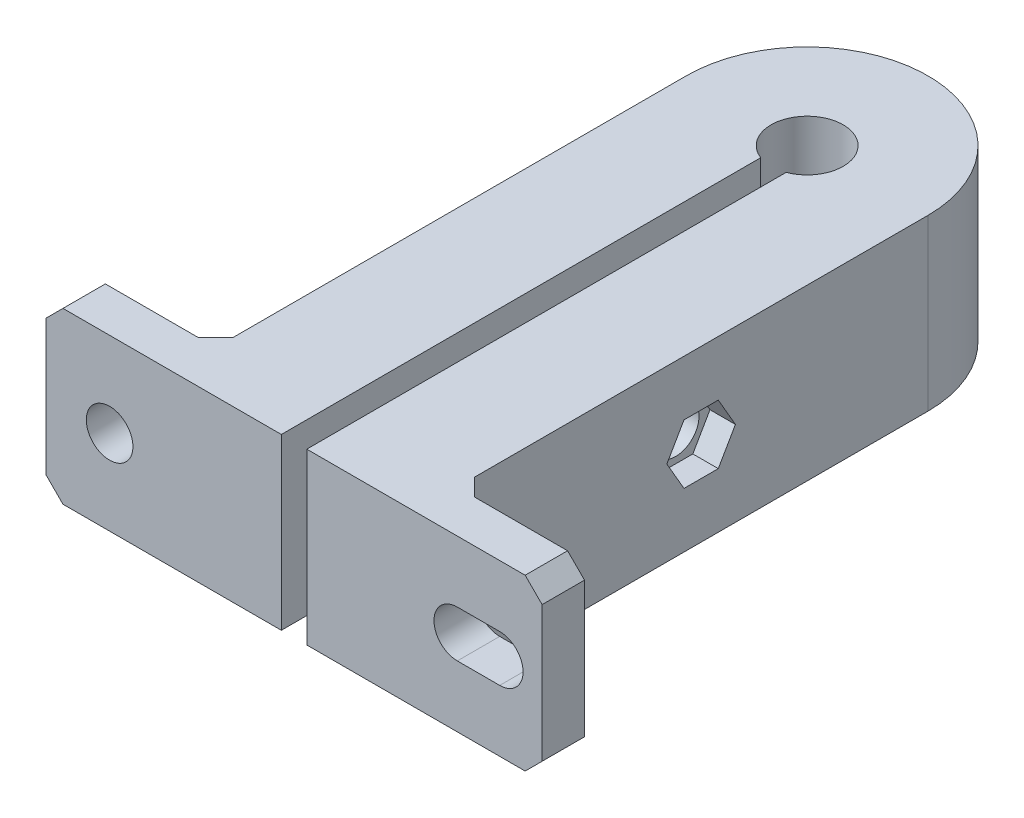
ISO-10303-21;
HEADER;
FILE_DESCRIPTION(('STEP AP214'),'2;1');
FILE_NAME('part.step','',(''),(''),'','','');
FILE_SCHEMA(('AUTOMOTIVE_DESIGN { 1 0 10303 214 1 1 1 1 }'));
ENDSEC;
DATA;
#1=APPLICATION_CONTEXT('core data for automotive mechanical design processes');
#2=APPLICATION_PROTOCOL_DEFINITION('international standard','automotive_design',2000,#1);
#3=PRODUCT_CONTEXT('',#1,'mechanical');
#4=PRODUCT('Part','Part','',(#3));
#5=PRODUCT_RELATED_PRODUCT_CATEGORY('part','',(#4));
#6=PRODUCT_DEFINITION_FORMATION('','',#4);
#7=PRODUCT_DEFINITION_CONTEXT('part definition',#1,'design');
#8=PRODUCT_DEFINITION('design','',#6,#7);
#9=PRODUCT_DEFINITION_SHAPE('','',#8);
#10=(LENGTH_UNIT() NAMED_UNIT(*) SI_UNIT(.MILLI.,.METRE.));
#11=(NAMED_UNIT(*) PLANE_ANGLE_UNIT() SI_UNIT($,.RADIAN.));
#12=(NAMED_UNIT(*) SI_UNIT($,.STERADIAN.) SOLID_ANGLE_UNIT());
#13=UNCERTAINTY_MEASURE_WITH_UNIT(LENGTH_MEASURE(1.E-05),#10,'distance_accuracy_value','');
#14=(GEOMETRIC_REPRESENTATION_CONTEXT(3) GLOBAL_UNCERTAINTY_ASSIGNED_CONTEXT((#13)) GLOBAL_UNIT_ASSIGNED_CONTEXT((#10,
#11,#12)) REPRESENTATION_CONTEXT('',''));
#15=CARTESIAN_POINT('',(0.,0.,0.));
#16=DIRECTION('',(0.,0.,1.));
#17=DIRECTION('',(1.,0.,0.));
#18=AXIS2_PLACEMENT_3D('',#15,#16,#17);
#19=CARTESIAN_POINT('',(-20.75,10.,26.75));
#20=DIRECTION('',(1.,0.,0.));
#21=DIRECTION('',(0.,0.,-1.));
#22=AXIS2_PLACEMENT_3D('',#19,#20,#21);
#23=CYLINDRICAL_SURFACE('',#22,2.75);
#24=CARTESIAN_POINT('',(-1.5,10.,26.75));
#25=DIRECTION('',(-1.,0.,0.));
#26=DIRECTION('',(0.,0.,1.));
#27=AXIS2_PLACEMENT_3D('',#24,#25,#26);
#28=CIRCLE('',#27,2.75);
#29=CARTESIAN_POINT('',(-1.5,10.,29.5));
#30=VERTEX_POINT('',#29);
#31=EDGE_CURVE('E279',#30,#30,#28,.T.);
#32=ORIENTED_EDGE('',*,*,#31,.F.);
#33=EDGE_LOOP('',(#32));
#34=FACE_BOUND('',#33,.T.);
#35=CARTESIAN_POINT('',(-10.25,10.,26.75));
#36=DIRECTION('',(-1.,0.,0.));
#37=DIRECTION('',(0.,0.,1.));
#38=AXIS2_PLACEMENT_3D('',#35,#36,#37);
#39=CIRCLE('',#38,2.75);
#40=CARTESIAN_POINT('',(-10.25,10.,29.5));
#41=VERTEX_POINT('',#40);
#42=EDGE_CURVE('E37',#41,#41,#39,.F.);
#43=ORIENTED_EDGE('',*,*,#42,.F.);
#44=EDGE_LOOP('',(#43));
#45=FACE_BOUND('',#44,.T.);
#46=ADVANCED_FACE('F33',(#34,#45),#23,.F.);
#47=CARTESIAN_POINT('',(1.5,10.,26.75));
#48=DIRECTION('',(-1.,0.,0.));
#49=DIRECTION('',(0.,0.,1.));
#50=AXIS2_PLACEMENT_3D('',#47,#48,#49);
#51=CIRCLE('',#50,2.75);
#52=CARTESIAN_POINT('',(1.5,10.,29.5));
#53=VERTEX_POINT('',#52);
#54=EDGE_CURVE('E283',#53,#53,#51,.T.);
#55=ORIENTED_EDGE('',*,*,#54,.T.);
#56=EDGE_LOOP('',(#55));
#57=FACE_BOUND('',#56,.T.);
#58=CARTESIAN_POINT('',(11.25,10.,26.75));
#59=DIRECTION('',(1.,0.,0.));
#60=DIRECTION('',(0.,0.,-1.));
#61=AXIS2_PLACEMENT_3D('',#58,#59,#60);
#62=CIRCLE('',#61,2.75);
#63=CARTESIAN_POINT('',(11.25,10.,24.));
#64=VERTEX_POINT('',#63);
#65=EDGE_CURVE('E271',#64,#64,#62,.F.);
#66=ORIENTED_EDGE('',*,*,#65,.F.);
#67=EDGE_LOOP('',(#66));
#68=FACE_BOUND('',#67,.T.);
#69=ADVANCED_FACE('F452',(#57,#68),#23,.F.);
#70=CARTESIAN_POINT('',(14.25,20.,60.5));
#71=DIRECTION('',(-1.,0.,0.));
#72=DIRECTION('',(0.,0.,1.));
#73=AXIS2_PLACEMENT_3D('',#70,#71,#72);
#74=PLANE('',#73);
#75=DIRECTION('',(0.,0.866025403784438,0.5));
#76=VECTOR('',#75,1.);
#77=CARTESIAN_POINT('',(14.25,10.,22.7085481156726));
#78=LINE('',#77,#76);
#79=CARTESIAN_POINT('',(14.25,10.,22.7085481156726));
#80=VERTEX_POINT('',#79);
#81=CARTESIAN_POINT('',(14.25,13.5,24.7292740578363));
#82=VERTEX_POINT('',#81);
#83=EDGE_CURVE('E259',#80,#82,#78,.T.);
#84=ORIENTED_EDGE('',*,*,#83,.F.);
#85=DIRECTION('',(0.,0.866025403784438,-0.5));
#86=VECTOR('',#85,1.);
#87=CARTESIAN_POINT('',(14.25,6.5,24.7292740578363));
#88=LINE('',#87,#86);
#89=CARTESIAN_POINT('',(14.25,6.5,24.7292740578363));
#90=VERTEX_POINT('',#89);
#91=EDGE_CURVE('E50',#90,#80,#88,.T.);
#92=ORIENTED_EDGE('',*,*,#91,.F.);
#93=DIRECTION('',(0.,0.,-1.));
#94=VECTOR('',#93,1.);
#95=CARTESIAN_POINT('',(14.25,6.5,28.7707259421637));
#96=LINE('',#95,#94);
#97=CARTESIAN_POINT('',(14.25,6.5,28.7707259421637));
#98=VERTEX_POINT('',#97);
#99=EDGE_CURVE('E242',#98,#90,#96,.T.);
#100=ORIENTED_EDGE('',*,*,#99,.F.);
#101=DIRECTION('',(0.,-0.866025403784439,-0.5));
#102=VECTOR('',#101,1.);
#103=CARTESIAN_POINT('',(14.25,10.,30.7914518843274));
#104=LINE('',#103,#102);
#105=CARTESIAN_POINT('',(14.25,10.,30.7914518843274));
#106=VERTEX_POINT('',#105);
#107=EDGE_CURVE('E245',#106,#98,#104,.T.);
#108=ORIENTED_EDGE('',*,*,#107,.F.);
#109=DIRECTION('',(0.,-0.866025403784439,0.5));
#110=VECTOR('',#109,1.);
#111=CARTESIAN_POINT('',(14.25,13.5,28.7707259421637));
#112=LINE('',#111,#110);
#113=CARTESIAN_POINT('',(14.25,13.5,28.7707259421637));
#114=VERTEX_POINT('',#113);
#115=EDGE_CURVE('E264',#114,#106,#112,.T.);
#116=ORIENTED_EDGE('',*,*,#115,.F.);
#117=DIRECTION('',(0.,0.,1.));
#118=VECTOR('',#117,1.);
#119=CARTESIAN_POINT('',(14.25,13.5,24.7292740578363));
#120=LINE('',#119,#118);
#121=EDGE_CURVE('E261',#82,#114,#120,.T.);
#122=ORIENTED_EDGE('',*,*,#121,.F.);
#123=EDGE_LOOP('',(#84,#92,#100,#108,#116,#122));
#124=FACE_BOUND('',#123,.T.);
#125=DIRECTION('',(0.,0.,-1.));
#126=VECTOR('',#125,1.);
#127=CARTESIAN_POINT('',(14.25,20.,60.5));
#128=LINE('',#127,#126);
#129=CARTESIAN_POINT('',(14.25,20.,53.5));
#130=VERTEX_POINT('',#129);
#131=CARTESIAN_POINT('',(14.25,20.,0.));
#132=VERTEX_POINT('',#131);
#133=EDGE_CURVE('E374',#130,#132,#128,.T.);
#134=ORIENTED_EDGE('',*,*,#133,.F.);
#135=DIRECTION('',(0.,-1.,0.));
#136=VECTOR('',#135,1.);
#137=CARTESIAN_POINT('',(14.25,0.,53.5));
#138=LINE('',#137,#136);
#139=CARTESIAN_POINT('',(14.25,0.,53.5));
#140=VERTEX_POINT('',#139);
#141=EDGE_CURVE('E404',#130,#140,#138,.T.);
#142=ORIENTED_EDGE('',*,*,#141,.T.);
#143=DIRECTION('',(0.,0.,-1.));
#144=VECTOR('',#143,1.);
#145=CARTESIAN_POINT('',(14.25,0.,60.5));
#146=LINE('',#145,#144);
#147=CARTESIAN_POINT('',(14.25,0.,0.));
#148=VERTEX_POINT('',#147);
#149=EDGE_CURVE('E368',#140,#148,#146,.T.);
#150=ORIENTED_EDGE('',*,*,#149,.T.);
#151=DIRECTION('',(0.,-1.,0.));
#152=VECTOR('',#151,1.);
#153=CARTESIAN_POINT('',(14.25,20.,0.));
#154=LINE('',#153,#152);
#155=EDGE_CURVE('E376',#132,#148,#154,.T.);
#156=ORIENTED_EDGE('',*,*,#155,.F.);
#157=EDGE_LOOP('',(#134,#142,#150,#156));
#158=FACE_BOUND('',#157,.T.);
#159=ADVANCED_FACE('F454',(#124,#158),#74,.F.);
#160=CARTESIAN_POINT('',(-14.25,20.,0.));
#161=DIRECTION('',(1.,0.,0.));
#162=DIRECTION('',(0.,0.,-1.));
#163=AXIS2_PLACEMENT_3D('',#160,#161,#162);
#164=PLANE('',#163);
#165=CARTESIAN_POINT('',(-14.25,10.,26.75));
#166=DIRECTION('',(-1.,0.,0.));
#167=DIRECTION('',(0.,0.,1.));
#168=AXIS2_PLACEMENT_3D('',#165,#166,#167);
#169=CIRCLE('',#168,4.);
#170=CARTESIAN_POINT('',(-14.25,10.,30.75));
#171=VERTEX_POINT('',#170);
#172=EDGE_CURVE('E248',#171,#171,#169,.T.);
#173=ORIENTED_EDGE('',*,*,#172,.F.);
#174=EDGE_LOOP('',(#173));
#175=FACE_BOUND('',#174,.T.);
#176=DIRECTION('',(0.,0.,1.));
#177=VECTOR('',#176,1.);
#178=CARTESIAN_POINT('',(-14.25,0.,0.));
#179=LINE('',#178,#177);
#180=CARTESIAN_POINT('',(-14.25,0.,0.));
#181=VERTEX_POINT('',#180);
#182=CARTESIAN_POINT('',(-14.25,0.,53.5));
#183=VERTEX_POINT('',#182);
#184=EDGE_CURVE('E379',#181,#183,#179,.T.);
#185=ORIENTED_EDGE('',*,*,#184,.T.);
#186=DIRECTION('',(0.,1.,0.));
#187=VECTOR('',#186,1.);
#188=CARTESIAN_POINT('',(-14.25,20.,53.5));
#189=LINE('',#188,#187);
#190=CARTESIAN_POINT('',(-14.25,20.,53.5));
#191=VERTEX_POINT('',#190);
#192=EDGE_CURVE('E399',#183,#191,#189,.T.);
#193=ORIENTED_EDGE('',*,*,#192,.T.);
#194=DIRECTION('',(0.,0.,1.));
#195=VECTOR('',#194,1.);
#196=CARTESIAN_POINT('',(-14.25,20.,0.));
#197=LINE('',#196,#195);
#198=CARTESIAN_POINT('',(-14.25,20.,0.));
#199=VERTEX_POINT('',#198);
#200=EDGE_CURVE('E367',#199,#191,#197,.T.);
#201=ORIENTED_EDGE('',*,*,#200,.F.);
#202=DIRECTION('',(0.,-1.,0.));
#203=VECTOR('',#202,1.);
#204=CARTESIAN_POINT('',(-14.25,20.,0.));
#205=LINE('',#204,#203);
#206=EDGE_CURVE('E388',#199,#181,#205,.T.);
#207=ORIENTED_EDGE('',*,*,#206,.T.);
#208=EDGE_LOOP('',(#185,#193,#201,#207));
#209=FACE_BOUND('',#208,.T.);
#210=ADVANCED_FACE('F461',(#175,#209),#164,.F.);
#211=CARTESIAN_POINT('',(0.,20.,0.));
#212=DIRECTION('',(0.,1.,0.));
#213=DIRECTION('',(0.,0.,1.));
#214=AXIS2_PLACEMENT_3D('',#211,#212,#213);
#215=PLANE('',#214);
#216=DIRECTION('',(1.,0.,0.));
#217=VECTOR('',#216,1.);
#218=CARTESIAN_POINT('',(-14.25,20.,60.5));
#219=LINE('',#218,#217);
#220=CARTESIAN_POINT('',(1.5,20.,60.5));
#221=VERTEX_POINT('',#220);
#222=CARTESIAN_POINT('',(27.25,20.,60.5));
#223=VERTEX_POINT('',#222);
#224=EDGE_CURVE('E371',#221,#223,#219,.T.);
#225=ORIENTED_EDGE('',*,*,#224,.T.);
#226=DIRECTION('',(0.,0.,-1.));
#227=VECTOR('',#226,1.);
#228=CARTESIAN_POINT('',(27.25,20.,55.5));
#229=LINE('',#228,#227);
#230=CARTESIAN_POINT('',(27.25,20.,55.5));
#231=VERTEX_POINT('',#230);
#232=EDGE_CURVE('E436',#223,#231,#229,.T.);
#233=ORIENTED_EDGE('',*,*,#232,.T.);
#234=DIRECTION('',(1.,0.,0.));
#235=VECTOR('',#234,1.);
#236=CARTESIAN_POINT('',(1.5,20.,55.5));
#237=LINE('',#236,#235);
#238=CARTESIAN_POINT('',(16.25,20.,55.5));
#239=VERTEX_POINT('',#238);
#240=EDGE_CURVE('E327',#239,#231,#237,.T.);
#241=ORIENTED_EDGE('',*,*,#240,.F.);
#242=DIRECTION('',(0.70710678118655,0.,0.707106781186545));
#243=VECTOR('',#242,1.);
#244=CARTESIAN_POINT('',(16.25,20.,55.5));
#245=LINE('',#244,#243);
#246=EDGE_CURVE('E410',#239,#130,#245,.F.);
#247=ORIENTED_EDGE('',*,*,#246,.T.);
#248=ORIENTED_EDGE('',*,*,#133,.T.);
#249=CARTESIAN_POINT('',(0.,20.,0.));
#250=DIRECTION('',(0.,1.,0.));
#251=DIRECTION('',(0.,0.,1.));
#252=AXIS2_PLACEMENT_3D('',#249,#250,#251);
#253=CIRCLE('',#252,14.25);
#254=EDGE_CURVE('E364',#132,#199,#253,.T.);
#255=ORIENTED_EDGE('',*,*,#254,.T.);
#256=ORIENTED_EDGE('',*,*,#200,.T.);
#257=DIRECTION('',(0.707106781186549,0.,-0.707106781186546));
#258=VECTOR('',#257,1.);
#259=CARTESIAN_POINT('',(-16.25,20.,55.5));
#260=LINE('',#259,#258);
#261=CARTESIAN_POINT('',(-16.25,20.,55.5));
#262=VERTEX_POINT('',#261);
#263=EDGE_CURVE('E408',#191,#262,#260,.F.);
#264=ORIENTED_EDGE('',*,*,#263,.T.);
#265=DIRECTION('',(-1.,0.,0.));
#266=VECTOR('',#265,1.);
#267=CARTESIAN_POINT('',(-1.5,20.,55.5));
#268=LINE('',#267,#266);
#269=CARTESIAN_POINT('',(-27.25,20.,55.5));
#270=VERTEX_POINT('',#269);
#271=EDGE_CURVE('E333',#262,#270,#268,.T.);
#272=ORIENTED_EDGE('',*,*,#271,.T.);
#273=DIRECTION('',(0.,0.,1.));
#274=VECTOR('',#273,1.);
#275=CARTESIAN_POINT('',(-27.25,20.,0.));
#276=LINE('',#275,#274);
#277=CARTESIAN_POINT('',(-27.25,20.,60.5));
#278=VERTEX_POINT('',#277);
#279=EDGE_CURVE('E433',#270,#278,#276,.T.);
#280=ORIENTED_EDGE('',*,*,#279,.T.);
#281=CARTESIAN_POINT('',(-1.5,20.,60.5));
#282=VERTEX_POINT('',#281);
#283=EDGE_CURVE('E372',#278,#282,#219,.T.);
#284=ORIENTED_EDGE('',*,*,#283,.T.);
#285=DIRECTION('',(0.,0.,1.));
#286=VECTOR('',#285,1.);
#287=CARTESIAN_POINT('',(-1.5,20.,0.));
#288=LINE('',#287,#286);
#289=CARTESIAN_POINT('',(-1.5,20.,3.97649343014672));
#290=VERTEX_POINT('',#289);
#291=EDGE_CURVE('E352',#290,#282,#288,.T.);
#292=ORIENTED_EDGE('',*,*,#291,.F.);
#293=CARTESIAN_POINT('',(0.,20.,0.));
#294=DIRECTION('',(0.,1.,0.));
#295=DIRECTION('',(0.,0.,1.));
#296=AXIS2_PLACEMENT_3D('',#293,#294,#295);
#297=CIRCLE('',#296,4.25);
#298=CARTESIAN_POINT('',(1.5,20.,3.97649343014672));
#299=VERTEX_POINT('',#298);
#300=EDGE_CURVE('E358',#299,#290,#297,.T.);
#301=ORIENTED_EDGE('',*,*,#300,.F.);
#302=DIRECTION('',(0.,0.,1.));
#303=VECTOR('',#302,1.);
#304=CARTESIAN_POINT('',(1.5,20.,0.));
#305=LINE('',#304,#303);
#306=EDGE_CURVE('E355',#299,#221,#305,.T.);
#307=ORIENTED_EDGE('',*,*,#306,.T.);
#308=EDGE_LOOP('',(#225,#233,#241,#247,#248,#255,#256,#264,#272,#280,#284,#292,#301,#307));
#309=FACE_BOUND('',#308,.T.);
#310=ADVANCED_FACE('F520',(#309),#215,.T.);
#311=CARTESIAN_POINT('',(0.,0.,0.));
#312=DIRECTION('',(0.,1.,0.));
#313=DIRECTION('',(0.,0.,1.));
#314=AXIS2_PLACEMENT_3D('',#311,#312,#313);
#315=PLANE('',#314);
#316=DIRECTION('',(-1.,0.,0.));
#317=VECTOR('',#316,1.);
#318=CARTESIAN_POINT('',(1.5,0.,55.5));
#319=LINE('',#318,#317);
#320=CARTESIAN_POINT('',(27.25,0.,55.5));
#321=VERTEX_POINT('',#320);
#322=CARTESIAN_POINT('',(16.25,0.,55.5));
#323=VERTEX_POINT('',#322);
#324=EDGE_CURVE('E322',#321,#323,#319,.T.);
#325=ORIENTED_EDGE('',*,*,#324,.F.);
#326=DIRECTION('',(0.,0.,1.));
#327=VECTOR('',#326,1.);
#328=CARTESIAN_POINT('',(27.25,0.,0.));
#329=LINE('',#328,#327);
#330=CARTESIAN_POINT('',(27.25,0.,60.5));
#331=VERTEX_POINT('',#330);
#332=EDGE_CURVE('E417',#321,#331,#329,.T.);
#333=ORIENTED_EDGE('',*,*,#332,.T.);
#334=DIRECTION('',(1.,0.,0.));
#335=VECTOR('',#334,1.);
#336=CARTESIAN_POINT('',(-14.25,0.,60.5));
#337=LINE('',#336,#335);
#338=CARTESIAN_POINT('',(1.5,0.,60.5));
#339=VERTEX_POINT('',#338);
#340=EDGE_CURVE('E382',#339,#331,#337,.T.);
#341=ORIENTED_EDGE('',*,*,#340,.F.);
#342=DIRECTION('',(0.,0.,-1.));
#343=VECTOR('',#342,1.);
#344=CARTESIAN_POINT('',(1.5,0.,60.5));
#345=LINE('',#344,#343);
#346=CARTESIAN_POINT('',(1.5,0.,3.97649343014672));
#347=VERTEX_POINT('',#346);
#348=EDGE_CURVE('E340',#339,#347,#345,.T.);
#349=ORIENTED_EDGE('',*,*,#348,.T.);
#350=CARTESIAN_POINT('',(0.,0.,0.));
#351=DIRECTION('',(0.,1.,0.));
#352=DIRECTION('',(0.,0.,1.));
#353=AXIS2_PLACEMENT_3D('',#350,#351,#352);
#354=CIRCLE('',#353,4.25);
#355=CARTESIAN_POINT('',(-1.5,0.,3.97649343014672));
#356=VERTEX_POINT('',#355);
#357=EDGE_CURVE('E357',#347,#356,#354,.T.);
#358=ORIENTED_EDGE('',*,*,#357,.T.);
#359=DIRECTION('',(0.,0.,-1.));
#360=VECTOR('',#359,1.);
#361=CARTESIAN_POINT('',(-1.5,0.,60.5));
#362=LINE('',#361,#360);
#363=CARTESIAN_POINT('',(-1.5,0.,60.5));
#364=VERTEX_POINT('',#363);
#365=EDGE_CURVE('E344',#364,#356,#362,.T.);
#366=ORIENTED_EDGE('',*,*,#365,.F.);
#367=CARTESIAN_POINT('',(-27.25,0.,60.5));
#368=VERTEX_POINT('',#367);
#369=EDGE_CURVE('E383',#368,#364,#337,.T.);
#370=ORIENTED_EDGE('',*,*,#369,.F.);
#371=DIRECTION('',(0.,0.,-1.));
#372=VECTOR('',#371,1.);
#373=CARTESIAN_POINT('',(-27.25,0.,55.5));
#374=LINE('',#373,#372);
#375=CARTESIAN_POINT('',(-27.25,0.,55.5));
#376=VERTEX_POINT('',#375);
#377=EDGE_CURVE('E415',#368,#376,#374,.T.);
#378=ORIENTED_EDGE('',*,*,#377,.T.);
#379=DIRECTION('',(1.,0.,0.));
#380=VECTOR('',#379,1.);
#381=CARTESIAN_POINT('',(-1.5,0.,55.5));
#382=LINE('',#381,#380);
#383=CARTESIAN_POINT('',(-16.25,0.,55.5));
#384=VERTEX_POINT('',#383);
#385=EDGE_CURVE('E338',#376,#384,#382,.T.);
#386=ORIENTED_EDGE('',*,*,#385,.T.);
#387=DIRECTION('',(-0.707106781186549,0.,0.707106781186546));
#388=VECTOR('',#387,1.);
#389=CARTESIAN_POINT('',(19.625,0.,19.6250000000001));
#390=LINE('',#389,#388);
#391=EDGE_CURVE('E406',#384,#183,#390,.F.);
#392=ORIENTED_EDGE('',*,*,#391,.T.);
#393=ORIENTED_EDGE('',*,*,#184,.F.);
#394=CARTESIAN_POINT('',(0.,0.,0.));
#395=DIRECTION('',(0.,1.,0.));
#396=DIRECTION('',(0.,0.,1.));
#397=AXIS2_PLACEMENT_3D('',#394,#395,#396);
#398=CIRCLE('',#397,14.25);
#399=EDGE_CURVE('E361',#148,#181,#398,.T.);
#400=ORIENTED_EDGE('',*,*,#399,.F.);
#401=ORIENTED_EDGE('',*,*,#149,.F.);
#402=DIRECTION('',(-0.70710678118655,0.,-0.707106781186545));
#403=VECTOR('',#402,1.);
#404=CARTESIAN_POINT('',(-19.625,0.,19.6250000000002));
#405=LINE('',#404,#403);
#406=EDGE_CURVE('E412',#140,#323,#405,.F.);
#407=ORIENTED_EDGE('',*,*,#406,.T.);
#408=EDGE_LOOP('',(#325,#333,#341,#349,#358,#366,#370,#378,#386,#392,#393,#400,#401,#407));
#409=FACE_BOUND('',#408,.T.);
#410=ADVANCED_FACE('F523',(#409),#315,.F.);
#411=CARTESIAN_POINT('',(-14.25,20.,60.5));
#412=DIRECTION('',(0.,0.,-1.));
#413=DIRECTION('',(-1.,0.,0.));
#414=AXIS2_PLACEMENT_3D('',#411,#412,#413);
#415=PLANE('',#414);
#416=DIRECTION('',(1.,0.,0.));
#417=VECTOR('',#416,1.);
#418=CARTESIAN_POINT('',(24.25,12.75,60.5));
#419=LINE('',#418,#417);
#420=CARTESIAN_POINT('',(19.25,12.75,60.5));
#421=VERTEX_POINT('',#420);
#422=CARTESIAN_POINT('',(24.25,12.75,60.5));
#423=VERTEX_POINT('',#422);
#424=EDGE_CURVE('E294',#421,#423,#419,.T.);
#425=ORIENTED_EDGE('',*,*,#424,.T.);
#426=CARTESIAN_POINT('',(24.25,10.,60.5));
#427=DIRECTION('',(0.,0.,-1.));
#428=DIRECTION('',(-1.,0.,0.));
#429=AXIS2_PLACEMENT_3D('',#426,#427,#428);
#430=CIRCLE('',#429,2.75);
#431=CARTESIAN_POINT('',(24.25,7.25,60.5));
#432=VERTEX_POINT('',#431);
#433=EDGE_CURVE('E284',#423,#432,#430,.T.);
#434=ORIENTED_EDGE('',*,*,#433,.T.);
#435=DIRECTION('',(-1.,0.,0.));
#436=VECTOR('',#435,1.);
#437=CARTESIAN_POINT('',(24.25,7.25,60.5));
#438=LINE('',#437,#436);
#439=CARTESIAN_POINT('',(19.25,7.25,60.5));
#440=VERTEX_POINT('',#439);
#441=EDGE_CURVE('E287',#432,#440,#438,.T.);
#442=ORIENTED_EDGE('',*,*,#441,.T.);
#443=CARTESIAN_POINT('',(19.25,10.,60.5));
#444=DIRECTION('',(0.,0.,-1.));
#445=DIRECTION('',(-1.,0.,0.));
#446=AXIS2_PLACEMENT_3D('',#443,#444,#445);
#447=CIRCLE('',#446,2.75);
#448=EDGE_CURVE('E291',#440,#421,#447,.T.);
#449=ORIENTED_EDGE('',*,*,#448,.T.);
#450=EDGE_LOOP('',(#425,#434,#442,#449));
#451=FACE_BOUND('',#450,.T.);
#452=ORIENTED_EDGE('',*,*,#340,.T.);
#453=DIRECTION('',(-0.707106781186545,-0.70710678118655,0.));
#454=VECTOR('',#453,1.);
#455=CARTESIAN_POINT('',(27.25,0.,60.5));
#456=LINE('',#455,#454);
#457=CARTESIAN_POINT('',(29.25,2.,60.5));
#458=VERTEX_POINT('',#457);
#459=EDGE_CURVE('E422',#331,#458,#456,.F.);
#460=ORIENTED_EDGE('',*,*,#459,.T.);
#461=DIRECTION('',(0.,-1.,0.));
#462=VECTOR('',#461,1.);
#463=CARTESIAN_POINT('',(29.25,0.,60.5));
#464=LINE('',#463,#462);
#465=CARTESIAN_POINT('',(29.25,18.,60.5));
#466=VERTEX_POINT('',#465);
#467=EDGE_CURVE('E319',#466,#458,#464,.T.);
#468=ORIENTED_EDGE('',*,*,#467,.F.);
#469=DIRECTION('',(-0.70710678118655,0.707106781186545,0.));
#470=VECTOR('',#469,1.);
#471=CARTESIAN_POINT('',(29.25,18.,60.5));
#472=LINE('',#471,#470);
#473=EDGE_CURVE('E420',#466,#223,#472,.T.);
#474=ORIENTED_EDGE('',*,*,#473,.T.);
#475=ORIENTED_EDGE('',*,*,#224,.F.);
#476=DIRECTION('',(0.,-1.,0.));
#477=VECTOR('',#476,1.);
#478=CARTESIAN_POINT('',(1.5,20.000012,60.5));
#479=LINE('',#478,#477);
#480=EDGE_CURVE('E346',#221,#339,#479,.T.);
#481=ORIENTED_EDGE('',*,*,#480,.T.);
#482=EDGE_LOOP('',(#452,#460,#468,#474,#475,#481));
#483=FACE_BOUND('',#482,.T.);
#484=ADVANCED_FACE('F518',(#451,#483),#415,.F.);
#485=CARTESIAN_POINT('',(0.,20.,0.));
#486=DIRECTION('',(0.,-1.,0.));
#487=DIRECTION('',(0.,0.,-1.));
#488=AXIS2_PLACEMENT_3D('',#485,#486,#487);
#489=CYLINDRICAL_SURFACE('',#488,4.25);
#490=ORIENTED_EDGE('',*,*,#357,.F.);
#491=DIRECTION('',(0.,-1.,0.));
#492=VECTOR('',#491,1.);
#493=CARTESIAN_POINT('',(1.5,20.,3.97649343014672));
#494=LINE('',#493,#492);
#495=EDGE_CURVE('E393',#347,#299,#494,.F.);
#496=ORIENTED_EDGE('',*,*,#495,.T.);
#497=ORIENTED_EDGE('',*,*,#300,.T.);
#498=DIRECTION('',(0.,-1.,0.));
#499=VECTOR('',#498,1.);
#500=CARTESIAN_POINT('',(-1.5,20.,3.97649343014672));
#501=LINE('',#500,#499);
#502=EDGE_CURVE('E391',#356,#290,#501,.F.);
#503=ORIENTED_EDGE('',*,*,#502,.F.);
#504=EDGE_LOOP('',(#490,#496,#497,#503));
#505=FACE_BOUND('',#504,.T.);
#506=ADVANCED_FACE('F514',(#505),#489,.F.);
#507=CARTESIAN_POINT('',(0.,20.,0.));
#508=DIRECTION('',(0.,-1.,0.));
#509=DIRECTION('',(0.,0.,-1.));
#510=AXIS2_PLACEMENT_3D('',#507,#508,#509);
#511=CYLINDRICAL_SURFACE('',#510,14.25);
#512=ORIENTED_EDGE('',*,*,#399,.T.);
#513=ORIENTED_EDGE('',*,*,#206,.F.);
#514=ORIENTED_EDGE('',*,*,#254,.F.);
#515=ORIENTED_EDGE('',*,*,#155,.T.);
#516=EDGE_LOOP('',(#512,#513,#514,#515));
#517=FACE_BOUND('',#516,.T.);
#518=ADVANCED_FACE('F517',(#517),#511,.T.);
#519=CARTESIAN_POINT('',(-21.75,9.99999999999999,60.5));
#520=DIRECTION('',(0.,0.,-1.));
#521=DIRECTION('',(-1.,0.,0.));
#522=AXIS2_PLACEMENT_3D('',#519,#520,#521);
#523=CIRCLE('',#522,2.75);
#524=CARTESIAN_POINT('',(-24.5,9.99999999999999,60.5));
#525=VERTEX_POINT('',#524);
#526=EDGE_CURVE('E316',#525,#525,#523,.T.);
#527=ORIENTED_EDGE('',*,*,#526,.T.);
#528=EDGE_LOOP('',(#527));
#529=FACE_BOUND('',#528,.T.);
#530=DIRECTION('',(0.,-1.,0.));
#531=VECTOR('',#530,1.);
#532=CARTESIAN_POINT('',(-29.25,0.,60.5));
#533=LINE('',#532,#531);
#534=CARTESIAN_POINT('',(-29.25,18.,60.5));
#535=VERTEX_POINT('',#534);
#536=CARTESIAN_POINT('',(-29.25,1.99999999999999,60.5));
#537=VERTEX_POINT('',#536);
#538=EDGE_CURVE('E330',#535,#537,#533,.T.);
#539=ORIENTED_EDGE('',*,*,#538,.T.);
#540=DIRECTION('',(0.70710678118655,-0.707106781186545,0.));
#541=VECTOR('',#540,1.);
#542=CARTESIAN_POINT('',(-29.25,1.99999999999999,60.5));
#543=LINE('',#542,#541);
#544=EDGE_CURVE('E445',#537,#368,#543,.T.);
#545=ORIENTED_EDGE('',*,*,#544,.T.);
#546=ORIENTED_EDGE('',*,*,#369,.T.);
#547=DIRECTION('',(0.,-1.,0.));
#548=VECTOR('',#547,1.);
#549=CARTESIAN_POINT('',(-1.5,20.000012,60.5));
#550=LINE('',#549,#548);
#551=EDGE_CURVE('E349',#282,#364,#550,.T.);
#552=ORIENTED_EDGE('',*,*,#551,.F.);
#553=ORIENTED_EDGE('',*,*,#283,.F.);
#554=DIRECTION('',(0.707106781186545,0.70710678118655,0.));
#555=VECTOR('',#554,1.);
#556=CARTESIAN_POINT('',(-27.25,20.,60.5));
#557=LINE('',#556,#555);
#558=EDGE_CURVE('E443',#278,#535,#557,.F.);
#559=ORIENTED_EDGE('',*,*,#558,.T.);
#560=EDGE_LOOP('',(#539,#545,#546,#552,#553,#559));
#561=FACE_BOUND('',#560,.T.);
#562=ADVANCED_FACE('F509',(#529,#561),#415,.F.);
#563=CARTESIAN_POINT('',(-1.5,20.000012,60.5));
#564=DIRECTION('',(-1.,0.,0.));
#565=DIRECTION('',(0.,0.,1.));
#566=AXIS2_PLACEMENT_3D('',#563,#564,#565);
#567=PLANE('',#566);
#568=ORIENTED_EDGE('',*,*,#31,.T.);
#569=EDGE_LOOP('',(#568));
#570=FACE_BOUND('',#569,.T.);
#571=ORIENTED_EDGE('',*,*,#365,.T.);
#572=ORIENTED_EDGE('',*,*,#502,.T.);
#573=ORIENTED_EDGE('',*,*,#291,.T.);
#574=ORIENTED_EDGE('',*,*,#551,.T.);
#575=EDGE_LOOP('',(#571,#572,#573,#574));
#576=FACE_BOUND('',#575,.T.);
#577=ADVANCED_FACE('F506',(#570,#576),#567,.F.);
#578=CARTESIAN_POINT('',(1.5,20.000012,60.5));
#579=DIRECTION('',(-1.,0.,0.));
#580=DIRECTION('',(0.,0.,1.));
#581=AXIS2_PLACEMENT_3D('',#578,#579,#580);
#582=PLANE('',#581);
#583=ORIENTED_EDGE('',*,*,#54,.F.);
#584=EDGE_LOOP('',(#583));
#585=FACE_BOUND('',#584,.T.);
#586=ORIENTED_EDGE('',*,*,#480,.F.);
#587=ORIENTED_EDGE('',*,*,#306,.F.);
#588=ORIENTED_EDGE('',*,*,#495,.F.);
#589=ORIENTED_EDGE('',*,*,#348,.F.);
#590=EDGE_LOOP('',(#586,#587,#588,#589));
#591=FACE_BOUND('',#590,.T.);
#592=ADVANCED_FACE('F501',(#585,#591),#582,.T.);
#593=CARTESIAN_POINT('',(0.,0.,55.5));
#594=DIRECTION('',(0.,0.,1.));
#595=DIRECTION('',(1.,0.,0.));
#596=AXIS2_PLACEMENT_3D('',#593,#594,#595);
#597=PLANE('',#596);
#598=CARTESIAN_POINT('',(-21.75,9.99999999999999,55.5));
#599=DIRECTION('',(0.,0.,-1.));
#600=DIRECTION('',(-1.,0.,0.));
#601=AXIS2_PLACEMENT_3D('',#598,#599,#600);
#602=CIRCLE('',#601,2.75);
#603=CARTESIAN_POINT('',(-24.5,9.99999999999999,55.5));
#604=VERTEX_POINT('',#603);
#605=EDGE_CURVE('E309',#604,#604,#602,.T.);
#606=ORIENTED_EDGE('',*,*,#605,.F.);
#607=EDGE_LOOP('',(#606));
#608=FACE_BOUND('',#607,.T.);
#609=ORIENTED_EDGE('',*,*,#385,.F.);
#610=DIRECTION('',(-0.70710678118655,0.707106781186545,0.));
#611=VECTOR('',#610,1.);
#612=CARTESIAN_POINT('',(-29.25,1.99999999999999,55.5));
#613=LINE('',#612,#611);
#614=CARTESIAN_POINT('',(-29.25,1.99999999999999,55.5));
#615=VERTEX_POINT('',#614);
#616=EDGE_CURVE('E11',#376,#615,#613,.T.);
#617=ORIENTED_EDGE('',*,*,#616,.T.);
#618=DIRECTION('',(0.,-1.,0.));
#619=VECTOR('',#618,1.);
#620=CARTESIAN_POINT('',(-29.25,0.,55.5));
#621=LINE('',#620,#619);
#622=CARTESIAN_POINT('',(-29.25,18.,55.5));
#623=VERTEX_POINT('',#622);
#624=EDGE_CURVE('E336',#623,#615,#621,.T.);
#625=ORIENTED_EDGE('',*,*,#624,.F.);
#626=DIRECTION('',(-0.707106781186545,-0.70710678118655,0.));
#627=VECTOR('',#626,1.);
#628=CARTESIAN_POINT('',(-27.25,20.,55.5));
#629=LINE('',#628,#627);
#630=EDGE_CURVE('E42',#623,#270,#629,.F.);
#631=ORIENTED_EDGE('',*,*,#630,.T.);
#632=ORIENTED_EDGE('',*,*,#271,.F.);
#633=DIRECTION('',(0.,-1.,0.));
#634=VECTOR('',#633,1.);
#635=CARTESIAN_POINT('',(-16.25,0.,55.5));
#636=LINE('',#635,#634);
#637=EDGE_CURVE('E396',#262,#384,#636,.T.);
#638=ORIENTED_EDGE('',*,*,#637,.T.);
#639=EDGE_LOOP('',(#609,#617,#625,#631,#632,#638));
#640=FACE_BOUND('',#639,.T.);
#641=ADVANCED_FACE('F498',(#608,#640),#597,.F.);
#642=CARTESIAN_POINT('',(-29.25,0.,55.5));
#643=DIRECTION('',(-1.,0.,0.));
#644=DIRECTION('',(0.,0.,1.));
#645=AXIS2_PLACEMENT_3D('',#642,#643,#644);
#646=PLANE('',#645);
#647=ORIENTED_EDGE('',*,*,#624,.T.);
#648=DIRECTION('',(0.,0.,1.));
#649=VECTOR('',#648,1.);
#650=CARTESIAN_POINT('',(-29.25,1.99999999999999,60.5));
#651=LINE('',#650,#649);
#652=EDGE_CURVE('E440',#615,#537,#651,.T.);
#653=ORIENTED_EDGE('',*,*,#652,.T.);
#654=ORIENTED_EDGE('',*,*,#538,.F.);
#655=DIRECTION('',(0.,0.,-1.));
#656=VECTOR('',#655,1.);
#657=CARTESIAN_POINT('',(-29.25,18.,55.5));
#658=LINE('',#657,#656);
#659=EDGE_CURVE('E438',#535,#623,#658,.T.);
#660=ORIENTED_EDGE('',*,*,#659,.T.);
#661=EDGE_LOOP('',(#647,#653,#654,#660));
#662=FACE_BOUND('',#661,.T.);
#663=ADVANCED_FACE('F493',(#662),#646,.T.);
#664=CARTESIAN_POINT('',(0.,0.,55.5));
#665=DIRECTION('',(0.,0.,1.));
#666=DIRECTION('',(-1.,0.,0.));
#667=AXIS2_PLACEMENT_3D('',#664,#665,#666);
#668=PLANE('',#667);
#669=DIRECTION('',(-1.,0.,0.));
#670=VECTOR('',#669,1.);
#671=CARTESIAN_POINT('',(24.25,7.25,55.5));
#672=LINE('',#671,#670);
#673=CARTESIAN_POINT('',(24.25,7.25,55.5));
#674=VERTEX_POINT('',#673);
#675=CARTESIAN_POINT('',(19.25,7.25,55.5));
#676=VERTEX_POINT('',#675);
#677=EDGE_CURVE('E299',#674,#676,#672,.T.);
#678=ORIENTED_EDGE('',*,*,#677,.F.);
#679=CARTESIAN_POINT('',(24.25,10.,55.5));
#680=DIRECTION('',(0.,0.,-1.));
#681=DIRECTION('',(-1.,0.,0.));
#682=AXIS2_PLACEMENT_3D('',#679,#680,#681);
#683=CIRCLE('',#682,2.75);
#684=CARTESIAN_POINT('',(24.25,12.75,55.5));
#685=VERTEX_POINT('',#684);
#686=EDGE_CURVE('E282',#685,#674,#683,.T.);
#687=ORIENTED_EDGE('',*,*,#686,.F.);
#688=DIRECTION('',(1.,0.,0.));
#689=VECTOR('',#688,1.);
#690=CARTESIAN_POINT('',(24.25,12.75,55.5));
#691=LINE('',#690,#689);
#692=CARTESIAN_POINT('',(19.25,12.75,55.5));
#693=VERTEX_POINT('',#692);
#694=EDGE_CURVE('E288',#693,#685,#691,.T.);
#695=ORIENTED_EDGE('',*,*,#694,.F.);
#696=CARTESIAN_POINT('',(19.25,10.,55.5));
#697=DIRECTION('',(0.,0.,-1.));
#698=DIRECTION('',(-1.,0.,0.));
#699=AXIS2_PLACEMENT_3D('',#696,#697,#698);
#700=CIRCLE('',#699,2.75);
#701=EDGE_CURVE('E302',#676,#693,#700,.T.);
#702=ORIENTED_EDGE('',*,*,#701,.F.);
#703=EDGE_LOOP('',(#678,#687,#695,#702));
#704=FACE_BOUND('',#703,.T.);
#705=DIRECTION('',(0.,-1.,0.));
#706=VECTOR('',#705,1.);
#707=CARTESIAN_POINT('',(29.25,0.,55.5));
#708=LINE('',#707,#706);
#709=CARTESIAN_POINT('',(29.25,18.,55.5));
#710=VERTEX_POINT('',#709);
#711=CARTESIAN_POINT('',(29.25,2.,55.5));
#712=VERTEX_POINT('',#711);
#713=EDGE_CURVE('E324',#710,#712,#708,.T.);
#714=ORIENTED_EDGE('',*,*,#713,.T.);
#715=DIRECTION('',(0.707106781186545,0.70710678118655,0.));
#716=VECTOR('',#715,1.);
#717=CARTESIAN_POINT('',(27.25,0.,55.5));
#718=LINE('',#717,#716);
#719=EDGE_CURVE('E431',#712,#321,#718,.F.);
#720=ORIENTED_EDGE('',*,*,#719,.T.);
#721=ORIENTED_EDGE('',*,*,#324,.T.);
#722=DIRECTION('',(0.,1.,0.));
#723=VECTOR('',#722,1.);
#724=CARTESIAN_POINT('',(16.25,20.,55.5));
#725=LINE('',#724,#723);
#726=EDGE_CURVE('E401',#323,#239,#725,.T.);
#727=ORIENTED_EDGE('',*,*,#726,.T.);
#728=ORIENTED_EDGE('',*,*,#240,.T.);
#729=DIRECTION('',(0.70710678118655,-0.707106781186545,0.));
#730=VECTOR('',#729,1.);
#731=CARTESIAN_POINT('',(29.25,18.,55.5));
#732=LINE('',#731,#730);
#733=EDGE_CURVE('E429',#231,#710,#732,.T.);
#734=ORIENTED_EDGE('',*,*,#733,.T.);
#735=EDGE_LOOP('',(#714,#720,#721,#727,#728,#734));
#736=FACE_BOUND('',#735,.T.);
#737=ADVANCED_FACE('F490',(#704,#736),#668,.F.);
#738=CARTESIAN_POINT('',(29.25,0.,55.5));
#739=DIRECTION('',(-1.,0.,0.));
#740=DIRECTION('',(0.,0.,1.));
#741=AXIS2_PLACEMENT_3D('',#738,#739,#740);
#742=PLANE('',#741);
#743=ORIENTED_EDGE('',*,*,#467,.T.);
#744=DIRECTION('',(0.,0.,-1.));
#745=VECTOR('',#744,1.);
#746=CARTESIAN_POINT('',(29.25,2.,55.5));
#747=LINE('',#746,#745);
#748=EDGE_CURVE('E427',#458,#712,#747,.T.);
#749=ORIENTED_EDGE('',*,*,#748,.T.);
#750=ORIENTED_EDGE('',*,*,#713,.F.);
#751=DIRECTION('',(0.,0.,1.));
#752=VECTOR('',#751,1.);
#753=CARTESIAN_POINT('',(29.25,18.,60.5));
#754=LINE('',#753,#752);
#755=EDGE_CURVE('E424',#710,#466,#754,.T.);
#756=ORIENTED_EDGE('',*,*,#755,.T.);
#757=EDGE_LOOP('',(#743,#749,#750,#756));
#758=FACE_BOUND('',#757,.T.);
#759=ADVANCED_FACE('F488',(#758),#742,.F.);
#760=CARTESIAN_POINT('',(-21.75,9.99999999999999,60.5));
#761=DIRECTION('',(0.,0.,-1.));
#762=DIRECTION('',(-1.,0.,0.));
#763=AXIS2_PLACEMENT_3D('',#760,#761,#762);
#764=CYLINDRICAL_SURFACE('',#763,2.75);
#765=ORIENTED_EDGE('',*,*,#526,.F.);
#766=EDGE_LOOP('',(#765));
#767=FACE_BOUND('',#766,.T.);
#768=ORIENTED_EDGE('',*,*,#605,.T.);
#769=EDGE_LOOP('',(#768));
#770=FACE_BOUND('',#769,.T.);
#771=ADVANCED_FACE('F484',(#767,#770),#764,.F.);
#772=CARTESIAN_POINT('',(24.25,10.,60.5));
#773=DIRECTION('',(0.,0.,-1.));
#774=DIRECTION('',(-1.,0.,0.));
#775=AXIS2_PLACEMENT_3D('',#772,#773,#774);
#776=CYLINDRICAL_SURFACE('',#775,2.75);
#777=ORIENTED_EDGE('',*,*,#686,.T.);
#778=DIRECTION('',(0.,0.,-1.));
#779=VECTOR('',#778,1.);
#780=CARTESIAN_POINT('',(24.25,7.25,60.5));
#781=LINE('',#780,#779);
#782=EDGE_CURVE('E297',#432,#674,#781,.T.);
#783=ORIENTED_EDGE('',*,*,#782,.F.);
#784=ORIENTED_EDGE('',*,*,#433,.F.);
#785=DIRECTION('',(0.,0.,-1.));
#786=VECTOR('',#785,1.);
#787=CARTESIAN_POINT('',(24.25,12.75,60.5));
#788=LINE('',#787,#786);
#789=EDGE_CURVE('E307',#423,#685,#788,.T.);
#790=ORIENTED_EDGE('',*,*,#789,.T.);
#791=EDGE_LOOP('',(#777,#783,#784,#790));
#792=FACE_BOUND('',#791,.T.);
#793=ADVANCED_FACE('F472',(#792),#776,.F.);
#794=CARTESIAN_POINT('',(24.25,12.75,60.5));
#795=DIRECTION('',(0.,1.,0.));
#796=DIRECTION('',(-1.,0.,0.));
#797=AXIS2_PLACEMENT_3D('',#794,#795,#796);
#798=PLANE('',#797);
#799=ORIENTED_EDGE('',*,*,#694,.T.);
#800=ORIENTED_EDGE('',*,*,#789,.F.);
#801=ORIENTED_EDGE('',*,*,#424,.F.);
#802=DIRECTION('',(0.,0.,-1.));
#803=VECTOR('',#802,1.);
#804=CARTESIAN_POINT('',(19.25,12.75,60.5));
#805=LINE('',#804,#803);
#806=EDGE_CURVE('E310',#421,#693,#805,.T.);
#807=ORIENTED_EDGE('',*,*,#806,.T.);
#808=EDGE_LOOP('',(#799,#800,#801,#807));
#809=FACE_BOUND('',#808,.T.);
#810=ADVANCED_FACE('F468',(#809),#798,.F.);
#811=CARTESIAN_POINT('',(19.25,10.,60.5));
#812=DIRECTION('',(0.,0.,-1.));
#813=DIRECTION('',(-1.,0.,0.));
#814=AXIS2_PLACEMENT_3D('',#811,#812,#813);
#815=CYLINDRICAL_SURFACE('',#814,2.75);
#816=ORIENTED_EDGE('',*,*,#701,.T.);
#817=ORIENTED_EDGE('',*,*,#806,.F.);
#818=ORIENTED_EDGE('',*,*,#448,.F.);
#819=DIRECTION('',(0.,0.,-1.));
#820=VECTOR('',#819,1.);
#821=CARTESIAN_POINT('',(19.25,7.25,60.5));
#822=LINE('',#821,#820);
#823=EDGE_CURVE('E312',#440,#676,#822,.T.);
#824=ORIENTED_EDGE('',*,*,#823,.T.);
#825=EDGE_LOOP('',(#816,#817,#818,#824));
#826=FACE_BOUND('',#825,.T.);
#827=ADVANCED_FACE('F471',(#826),#815,.F.);
#828=CARTESIAN_POINT('',(24.25,7.25,60.5));
#829=DIRECTION('',(0.,-1.,0.));
#830=DIRECTION('',(1.,0.,0.));
#831=AXIS2_PLACEMENT_3D('',#828,#829,#830);
#832=PLANE('',#831);
#833=ORIENTED_EDGE('',*,*,#677,.T.);
#834=ORIENTED_EDGE('',*,*,#823,.F.);
#835=ORIENTED_EDGE('',*,*,#441,.F.);
#836=ORIENTED_EDGE('',*,*,#782,.T.);
#837=EDGE_LOOP('',(#833,#834,#835,#836));
#838=FACE_BOUND('',#837,.T.);
#839=ADVANCED_FACE('F476',(#838),#832,.F.);
#840=CARTESIAN_POINT('',(-16.25,0.,55.5));
#841=DIRECTION('',(-0.707106781186546,0.,-0.707106781186549));
#842=DIRECTION('',(0.,1.,0.));
#843=AXIS2_PLACEMENT_3D('',#840,#841,#842);
#844=PLANE('',#843);
#845=ORIENTED_EDGE('',*,*,#263,.F.);
#846=ORIENTED_EDGE('',*,*,#192,.F.);
#847=ORIENTED_EDGE('',*,*,#391,.F.);
#848=ORIENTED_EDGE('',*,*,#637,.F.);
#849=EDGE_LOOP('',(#845,#846,#847,#848));
#850=FACE_BOUND('',#849,.T.);
#851=ADVANCED_FACE('F480',(#850),#844,.T.);
#852=CARTESIAN_POINT('',(16.25,0.,55.5));
#853=DIRECTION('',(0.707106781186545,0.,-0.70710678118655));
#854=DIRECTION('',(0.,-1.,0.));
#855=AXIS2_PLACEMENT_3D('',#852,#853,#854);
#856=PLANE('',#855);
#857=ORIENTED_EDGE('',*,*,#406,.F.);
#858=ORIENTED_EDGE('',*,*,#141,.F.);
#859=ORIENTED_EDGE('',*,*,#246,.F.);
#860=ORIENTED_EDGE('',*,*,#726,.F.);
#861=EDGE_LOOP('',(#857,#858,#859,#860));
#862=FACE_BOUND('',#861,.T.);
#863=ADVANCED_FACE('F539',(#862),#856,.T.);
#864=CARTESIAN_POINT('',(27.25,0.,0.));
#865=DIRECTION('',(-0.70710678118655,0.707106781186545,0.));
#866=DIRECTION('',(0.,0.,1.));
#867=AXIS2_PLACEMENT_3D('',#864,#865,#866);
#868=PLANE('',#867);
#869=ORIENTED_EDGE('',*,*,#719,.F.);
#870=ORIENTED_EDGE('',*,*,#748,.F.);
#871=ORIENTED_EDGE('',*,*,#459,.F.);
#872=ORIENTED_EDGE('',*,*,#332,.F.);
#873=EDGE_LOOP('',(#869,#870,#871,#872));
#874=FACE_BOUND('',#873,.T.);
#875=ADVANCED_FACE('F543',(#874),#868,.F.);
#876=CARTESIAN_POINT('',(29.25,18.,55.5));
#877=DIRECTION('',(0.707106781186545,0.70710678118655,0.));
#878=DIRECTION('',(0.,0.,-1.));
#879=AXIS2_PLACEMENT_3D('',#876,#877,#878);
#880=PLANE('',#879);
#881=ORIENTED_EDGE('',*,*,#733,.F.);
#882=ORIENTED_EDGE('',*,*,#232,.F.);
#883=ORIENTED_EDGE('',*,*,#473,.F.);
#884=ORIENTED_EDGE('',*,*,#755,.F.);
#885=EDGE_LOOP('',(#881,#882,#883,#884));
#886=FACE_BOUND('',#885,.T.);
#887=ADVANCED_FACE('F547',(#886),#880,.T.);
#888=CARTESIAN_POINT('',(-29.25,1.99999999999999,55.5));
#889=DIRECTION('',(-0.707106781186545,-0.70710678118655,0.));
#890=DIRECTION('',(0.,0.,-1.));
#891=AXIS2_PLACEMENT_3D('',#888,#889,#890);
#892=PLANE('',#891);
#893=ORIENTED_EDGE('',*,*,#616,.F.);
#894=ORIENTED_EDGE('',*,*,#377,.F.);
#895=ORIENTED_EDGE('',*,*,#544,.F.);
#896=ORIENTED_EDGE('',*,*,#652,.F.);
#897=EDGE_LOOP('',(#893,#894,#895,#896));
#898=FACE_BOUND('',#897,.T.);
#899=ADVANCED_FACE('F550',(#898),#892,.T.);
#900=CARTESIAN_POINT('',(-27.25,20.,0.));
#901=DIRECTION('',(0.70710678118655,-0.707106781186545,0.));
#902=DIRECTION('',(0.,0.,1.));
#903=AXIS2_PLACEMENT_3D('',#900,#901,#902);
#904=PLANE('',#903);
#905=ORIENTED_EDGE('',*,*,#630,.F.);
#906=ORIENTED_EDGE('',*,*,#659,.F.);
#907=ORIENTED_EDGE('',*,*,#558,.F.);
#908=ORIENTED_EDGE('',*,*,#279,.F.);
#909=EDGE_LOOP('',(#905,#906,#907,#908));
#910=FACE_BOUND('',#909,.T.);
#911=ADVANCED_FACE('F35',(#910),#904,.F.);
#912=CARTESIAN_POINT('',(11.25,0.,0.));
#913=DIRECTION('',(1.,0.,0.));
#914=DIRECTION('',(0.,0.,-1.));
#915=AXIS2_PLACEMENT_3D('',#912,#913,#914);
#916=PLANE('',#915);
#917=DIRECTION('',(0.,0.866025403784438,-0.5));
#918=VECTOR('',#917,1.);
#919=CARTESIAN_POINT('',(11.25,6.5,24.7292740578363));
#920=LINE('',#919,#918);
#921=CARTESIAN_POINT('',(11.25,6.5,24.7292740578363));
#922=VERTEX_POINT('',#921);
#923=CARTESIAN_POINT('',(11.25,10.,22.7085481156726));
#924=VERTEX_POINT('',#923);
#925=EDGE_CURVE('E222',#922,#924,#920,.T.);
#926=ORIENTED_EDGE('',*,*,#925,.T.);
#927=DIRECTION('',(0.,0.866025403784438,0.5));
#928=VECTOR('',#927,1.);
#929=CARTESIAN_POINT('',(11.25,10.,22.7085481156726));
#930=LINE('',#929,#928);
#931=CARTESIAN_POINT('',(11.25,13.5,24.7292740578363));
#932=VERTEX_POINT('',#931);
#933=EDGE_CURVE('E231',#924,#932,#930,.T.);
#934=ORIENTED_EDGE('',*,*,#933,.T.);
#935=DIRECTION('',(0.,0.,1.));
#936=VECTOR('',#935,1.);
#937=CARTESIAN_POINT('',(11.25,13.5,24.7292740578363));
#938=LINE('',#937,#936);
#939=CARTESIAN_POINT('',(11.25,13.5,28.7707259421637));
#940=VERTEX_POINT('',#939);
#941=EDGE_CURVE('E236',#932,#940,#938,.T.);
#942=ORIENTED_EDGE('',*,*,#941,.T.);
#943=DIRECTION('',(0.,-0.866025403784439,0.5));
#944=VECTOR('',#943,1.);
#945=CARTESIAN_POINT('',(11.25,13.5,28.7707259421637));
#946=LINE('',#945,#944);
#947=CARTESIAN_POINT('',(11.25,10.,30.7914518843274));
#948=VERTEX_POINT('',#947);
#949=EDGE_CURVE('E252',#940,#948,#946,.T.);
#950=ORIENTED_EDGE('',*,*,#949,.T.);
#951=DIRECTION('',(0.,-0.866025403784439,-0.5));
#952=VECTOR('',#951,1.);
#953=CARTESIAN_POINT('',(11.25,10.,30.7914518843274));
#954=LINE('',#953,#952);
#955=CARTESIAN_POINT('',(11.25,6.5,28.7707259421637));
#956=VERTEX_POINT('',#955);
#957=EDGE_CURVE('E255',#948,#956,#954,.T.);
#958=ORIENTED_EDGE('',*,*,#957,.T.);
#959=DIRECTION('',(0.,0.,-1.));
#960=VECTOR('',#959,1.);
#961=CARTESIAN_POINT('',(11.25,6.5,28.7707259421637));
#962=LINE('',#961,#960);
#963=EDGE_CURVE('E228',#956,#922,#962,.T.);
#964=ORIENTED_EDGE('',*,*,#963,.T.);
#965=EDGE_LOOP('',(#926,#934,#942,#950,#958,#964));
#966=FACE_BOUND('',#965,.T.);
#967=ORIENTED_EDGE('',*,*,#65,.T.);
#968=EDGE_LOOP('',(#967));
#969=FACE_BOUND('',#968,.T.);
#970=ADVANCED_FACE('F238',(#966,#969),#916,.T.);
#971=CARTESIAN_POINT('',(11.25,6.5,24.7292740578363));
#972=DIRECTION('',(0.,-0.5,-0.866025403784439));
#973=DIRECTION('',(0.,0.866025403784439,-0.5));
#974=AXIS2_PLACEMENT_3D('',#971,#972,#973);
#975=PLANE('',#974);
#976=ORIENTED_EDGE('',*,*,#91,.T.);
#977=DIRECTION('',(1.,0.,0.));
#978=VECTOR('',#977,1.);
#979=CARTESIAN_POINT('',(11.25,10.,22.7085481156726));
#980=LINE('',#979,#978);
#981=EDGE_CURVE('E218',#924,#80,#980,.T.);
#982=ORIENTED_EDGE('',*,*,#981,.F.);
#983=ORIENTED_EDGE('',*,*,#925,.F.);
#984=DIRECTION('',(1.,0.,0.));
#985=VECTOR('',#984,1.);
#986=CARTESIAN_POINT('',(11.25,6.5,24.7292740578363));
#987=LINE('',#986,#985);
#988=EDGE_CURVE('E269',#922,#90,#987,.T.);
#989=ORIENTED_EDGE('',*,*,#988,.T.);
#990=EDGE_LOOP('',(#976,#982,#983,#989));
#991=FACE_BOUND('',#990,.T.);
#992=ADVANCED_FACE('F220',(#991),#975,.F.);
#993=CARTESIAN_POINT('',(11.25,6.5,28.7707259421637));
#994=DIRECTION('',(0.,-1.,0.));
#995=DIRECTION('',(0.,0.,-1.));
#996=AXIS2_PLACEMENT_3D('',#993,#994,#995);
#997=PLANE('',#996);
#998=ORIENTED_EDGE('',*,*,#99,.T.);
#999=ORIENTED_EDGE('',*,*,#988,.F.);
#1000=ORIENTED_EDGE('',*,*,#963,.F.);
#1001=DIRECTION('',(1.,0.,0.));
#1002=VECTOR('',#1001,1.);
#1003=CARTESIAN_POINT('',(11.25,6.5,28.7707259421637));
#1004=LINE('',#1003,#1002);
#1005=EDGE_CURVE('E272',#956,#98,#1004,.T.);
#1006=ORIENTED_EDGE('',*,*,#1005,.T.);
#1007=EDGE_LOOP('',(#998,#999,#1000,#1006));
#1008=FACE_BOUND('',#1007,.T.);
#1009=ADVANCED_FACE('F722',(#1008),#997,.F.);
#1010=CARTESIAN_POINT('',(11.25,10.,30.7914518843274));
#1011=DIRECTION('',(0.,-0.5,0.866025403784439));
#1012=DIRECTION('',(0.,-0.866025403784439,-0.5));
#1013=AXIS2_PLACEMENT_3D('',#1010,#1011,#1012);
#1014=PLANE('',#1013);
#1015=ORIENTED_EDGE('',*,*,#107,.T.);
#1016=ORIENTED_EDGE('',*,*,#1005,.F.);
#1017=ORIENTED_EDGE('',*,*,#957,.F.);
#1018=DIRECTION('',(1.,0.,0.));
#1019=VECTOR('',#1018,1.);
#1020=CARTESIAN_POINT('',(11.25,10.,30.7914518843274));
#1021=LINE('',#1020,#1019);
#1022=EDGE_CURVE('E274',#948,#106,#1021,.T.);
#1023=ORIENTED_EDGE('',*,*,#1022,.T.);
#1024=EDGE_LOOP('',(#1015,#1016,#1017,#1023));
#1025=FACE_BOUND('',#1024,.T.);
#1026=ADVANCED_FACE('F728',(#1025),#1014,.F.);
#1027=CARTESIAN_POINT('',(11.25,13.5,28.7707259421637));
#1028=DIRECTION('',(0.,0.5,0.866025403784439));
#1029=DIRECTION('',(0.,-0.866025403784439,0.5));
#1030=AXIS2_PLACEMENT_3D('',#1027,#1028,#1029);
#1031=PLANE('',#1030);
#1032=ORIENTED_EDGE('',*,*,#115,.T.);
#1033=ORIENTED_EDGE('',*,*,#1022,.F.);
#1034=ORIENTED_EDGE('',*,*,#949,.F.);
#1035=DIRECTION('',(1.,0.,0.));
#1036=VECTOR('',#1035,1.);
#1037=CARTESIAN_POINT('',(11.25,13.5,28.7707259421637));
#1038=LINE('',#1037,#1036);
#1039=EDGE_CURVE('E276',#940,#114,#1038,.T.);
#1040=ORIENTED_EDGE('',*,*,#1039,.T.);
#1041=EDGE_LOOP('',(#1032,#1033,#1034,#1040));
#1042=FACE_BOUND('',#1041,.T.);
#1043=ADVANCED_FACE('F736',(#1042),#1031,.F.);
#1044=CARTESIAN_POINT('',(11.25,13.5,24.7292740578363));
#1045=DIRECTION('',(0.,1.,0.));
#1046=DIRECTION('',(0.,0.,1.));
#1047=AXIS2_PLACEMENT_3D('',#1044,#1045,#1046);
#1048=PLANE('',#1047);
#1049=ORIENTED_EDGE('',*,*,#121,.T.);
#1050=ORIENTED_EDGE('',*,*,#1039,.F.);
#1051=ORIENTED_EDGE('',*,*,#941,.F.);
#1052=DIRECTION('',(1.,0.,0.));
#1053=VECTOR('',#1052,1.);
#1054=CARTESIAN_POINT('',(11.25,13.5,24.7292740578363));
#1055=LINE('',#1054,#1053);
#1056=EDGE_CURVE('E227',#932,#82,#1055,.T.);
#1057=ORIENTED_EDGE('',*,*,#1056,.T.);
#1058=EDGE_LOOP('',(#1049,#1050,#1051,#1057));
#1059=FACE_BOUND('',#1058,.T.);
#1060=ADVANCED_FACE('F744',(#1059),#1048,.F.);
#1061=CARTESIAN_POINT('',(11.25,10.,22.7085481156726));
#1062=DIRECTION('',(0.,0.500000000000001,-0.866025403784438));
#1063=DIRECTION('',(0.,0.866025403784438,0.500000000000001));
#1064=AXIS2_PLACEMENT_3D('',#1061,#1062,#1063);
#1065=PLANE('',#1064);
#1066=ORIENTED_EDGE('',*,*,#83,.T.);
#1067=ORIENTED_EDGE('',*,*,#1056,.F.);
#1068=ORIENTED_EDGE('',*,*,#933,.F.);
#1069=ORIENTED_EDGE('',*,*,#981,.T.);
#1070=EDGE_LOOP('',(#1066,#1067,#1068,#1069));
#1071=FACE_BOUND('',#1070,.T.);
#1072=ADVANCED_FACE('F232',(#1071),#1065,.F.);
#1073=CARTESIAN_POINT('',(-10.25,10.,26.75));
#1074=DIRECTION('',(-1.,0.,0.));
#1075=DIRECTION('',(0.,0.,1.));
#1076=AXIS2_PLACEMENT_3D('',#1073,#1074,#1075);
#1077=PLANE('',#1076);
#1078=CARTESIAN_POINT('',(-10.25,10.,26.75));
#1079=DIRECTION('',(-1.,0.,0.));
#1080=DIRECTION('',(0.,0.,1.));
#1081=AXIS2_PLACEMENT_3D('',#1078,#1079,#1080);
#1082=CIRCLE('',#1081,4.);
#1083=CARTESIAN_POINT('',(-10.25,10.,30.75));
#1084=VERTEX_POINT('',#1083);
#1085=EDGE_CURVE('E880',#1084,#1084,#1082,.T.);
#1086=ORIENTED_EDGE('',*,*,#1085,.T.);
#1087=EDGE_LOOP('',(#1086));
#1088=FACE_BOUND('',#1087,.T.);
#1089=ORIENTED_EDGE('',*,*,#42,.T.);
#1090=EDGE_LOOP('',(#1089));
#1091=FACE_BOUND('',#1090,.T.);
#1092=ADVANCED_FACE('F759',(#1088,#1091),#1077,.T.);
#1093=CARTESIAN_POINT('',(-10.25,10.,26.75));
#1094=DIRECTION('',(-1.,0.,0.));
#1095=DIRECTION('',(0.,0.,1.));
#1096=AXIS2_PLACEMENT_3D('',#1093,#1094,#1095);
#1097=CYLINDRICAL_SURFACE('',#1096,4.);
#1098=ORIENTED_EDGE('',*,*,#1085,.F.);
#1099=EDGE_LOOP('',(#1098));
#1100=FACE_BOUND('',#1099,.T.);
#1101=ORIENTED_EDGE('',*,*,#172,.T.);
#1102=EDGE_LOOP('',(#1101));
#1103=FACE_BOUND('',#1102,.T.);
#1104=ADVANCED_FACE('F766',(#1100,#1103),#1097,.F.);
#1105=CLOSED_SHELL('',(#46,#69,#159,#210,#310,#410,#484,#506,#518,#562,#577,#592,#641,#663,#737,
#759,#771,#793,#810,#827,#839,#851,#863,#875,#887,#899,#911,#970,#992,#1009,#1026,#1043,#1060,
#1072,#1092,#1104));
#1106=MANIFOLD_SOLID_BREP('B2',#1105);
#1107=ADVANCED_BREP_SHAPE_REPRESENTATION('',(#18,#1106),#14);
#1108=SHAPE_DEFINITION_REPRESENTATION(#9,#1107);
ENDSEC;
END-ISO-10303-21;
